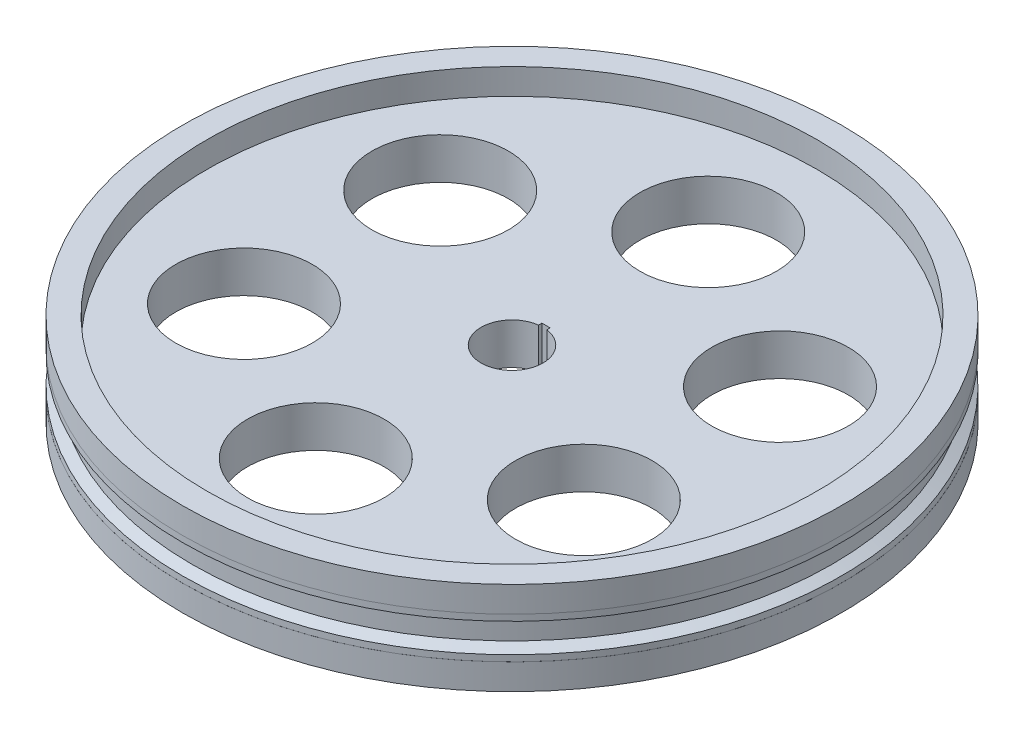
ISO-10303-21;
HEADER;
FILE_DESCRIPTION(('STEP AP214'),'2;1');
FILE_NAME('part.step','',(''),(''),'','','');
FILE_SCHEMA(('AUTOMOTIVE_DESIGN { 1 0 10303 214 1 1 1 1 }'));
ENDSEC;
DATA;
#1=APPLICATION_CONTEXT('core data for automotive mechanical design processes');
#2=APPLICATION_PROTOCOL_DEFINITION('international standard','automotive_design',2000,#1);
#3=PRODUCT_CONTEXT('',#1,'mechanical');
#4=PRODUCT('Part','Part','',(#3));
#5=PRODUCT_RELATED_PRODUCT_CATEGORY('part','',(#4));
#6=PRODUCT_DEFINITION_FORMATION('','',#4);
#7=PRODUCT_DEFINITION_CONTEXT('part definition',#1,'design');
#8=PRODUCT_DEFINITION('design','',#6,#7);
#9=PRODUCT_DEFINITION_SHAPE('','',#8);
#10=(LENGTH_UNIT() NAMED_UNIT(*) SI_UNIT(.MILLI.,.METRE.));
#11=(NAMED_UNIT(*) PLANE_ANGLE_UNIT() SI_UNIT($,.RADIAN.));
#12=(NAMED_UNIT(*) SI_UNIT($,.STERADIAN.) SOLID_ANGLE_UNIT());
#13=UNCERTAINTY_MEASURE_WITH_UNIT(LENGTH_MEASURE(1.E-05),#10,'distance_accuracy_value','');
#14=(GEOMETRIC_REPRESENTATION_CONTEXT(3) GLOBAL_UNCERTAINTY_ASSIGNED_CONTEXT((#13)) GLOBAL_UNIT_ASSIGNED_CONTEXT((#10,
#11,#12)) REPRESENTATION_CONTEXT('',''));
#15=CARTESIAN_POINT('',(0.,0.,0.));
#16=DIRECTION('',(0.,0.,1.));
#17=DIRECTION('',(1.,0.,0.));
#18=AXIS2_PLACEMENT_3D('',#15,#16,#17);
#19=CARTESIAN_POINT('',(0.,-10.,0.));
#20=DIRECTION('',(0.,1.,0.));
#21=DIRECTION('',(0.,0.,1.));
#22=AXIS2_PLACEMENT_3D('',#19,#20,#21);
#23=PLANE('',#22);
#24=CARTESIAN_POINT('',(-82.3240268063419,-10.,-47.5297990374131));
#25=DIRECTION('',(0.,1.,0.));
#26=DIRECTION('',(0.,0.,1.));
#27=AXIS2_PLACEMENT_3D('',#24,#25,#26);
#28=CIRCLE('',#27,33.0759403003965);
#29=CARTESIAN_POINT('',(-82.3240268063419,-10.,-14.4538587370166));
#30=VERTEX_POINT('',#29);
#31=EDGE_CURVE('E252',#30,#30,#28,.T.);
#32=ORIENTED_EDGE('',*,*,#31,.T.);
#33=EDGE_LOOP('',(#32));
#34=FACE_BOUND('',#33,.T.);
#35=CARTESIAN_POINT('',(-82.3240268063378,-10.,47.5297990374201));
#36=DIRECTION('',(0.,1.,0.));
#37=DIRECTION('',(0.,0.,1.));
#38=AXIS2_PLACEMENT_3D('',#35,#36,#37);
#39=CIRCLE('',#38,33.0759403004001);
#40=CARTESIAN_POINT('',(-82.3240268063378,-10.,80.6057393378202));
#41=VERTEX_POINT('',#40);
#42=EDGE_CURVE('E256',#41,#41,#39,.T.);
#43=ORIENTED_EDGE('',*,*,#42,.T.);
#44=EDGE_LOOP('',(#43));
#45=FACE_BOUND('',#44,.T.);
#46=CARTESIAN_POINT('',(8.07034449540853E-12,-10.,95.0595980748332));
#47=DIRECTION('',(0.,1.,0.));
#48=DIRECTION('',(0.,0.,1.));
#49=AXIS2_PLACEMENT_3D('',#46,#47,#48);
#50=CIRCLE('',#49,33.0759403004008);
#51=CARTESIAN_POINT('',(8.07034449540853E-12,-10.,128.135538375234));
#52=VERTEX_POINT('',#51);
#53=EDGE_CURVE('E262',#52,#52,#50,.T.);
#54=ORIENTED_EDGE('',*,*,#53,.T.);
#55=EDGE_LOOP('',(#54));
#56=FACE_BOUND('',#55,.T.);
#57=CARTESIAN_POINT('',(82.3240268063499,-10.,47.5297990374131));
#58=DIRECTION('',(0.,1.,0.));
#59=DIRECTION('',(0.,0.,1.));
#60=AXIS2_PLACEMENT_3D('',#57,#58,#59);
#61=CIRCLE('',#60,33.0759403003976);
#62=CARTESIAN_POINT('',(82.3240268063499,-10.,80.6057393378107));
#63=VERTEX_POINT('',#62);
#64=EDGE_CURVE('E268',#63,#63,#61,.T.);
#65=ORIENTED_EDGE('',*,*,#64,.T.);
#66=EDGE_LOOP('',(#65));
#67=FACE_BOUND('',#66,.T.);
#68=CARTESIAN_POINT('',(82.3240268063459,-10.,-47.5297990374201));
#69=DIRECTION('',(0.,1.,0.));
#70=DIRECTION('',(0.,0.,1.));
#71=AXIS2_PLACEMENT_3D('',#68,#69,#70);
#72=CIRCLE('',#71,33.0759403003936);
#73=CARTESIAN_POINT('',(82.3240268063459,-10.,-14.4538587370266));
#74=VERTEX_POINT('',#73);
#75=EDGE_CURVE('E274',#74,#74,#72,.T.);
#76=ORIENTED_EDGE('',*,*,#75,.T.);
#77=EDGE_LOOP('',(#76));
#78=FACE_BOUND('',#77,.T.);
#79=CARTESIAN_POINT('',(0.,-10.,-95.0595980748332));
#80=DIRECTION('',(0.,1.,0.));
#81=DIRECTION('',(0.,0.,1.));
#82=AXIS2_PLACEMENT_3D('',#79,#80,#81);
#83=CIRCLE('',#82,33.0759403003924);
#84=CARTESIAN_POINT('',(0.,-10.,-61.9836577744408));
#85=VERTEX_POINT('',#84);
#86=EDGE_CURVE('E280',#85,#85,#83,.T.);
#87=ORIENTED_EDGE('',*,*,#86,.T.);
#88=EDGE_LOOP('',(#87));
#89=FACE_BOUND('',#88,.T.);
#90=CARTESIAN_POINT('',(0.,-10.,0.));
#91=DIRECTION('',(0.,1.,0.));
#92=DIRECTION('',(0.,0.,1.));
#93=AXIS2_PLACEMENT_3D('',#90,#91,#92);
#94=CIRCLE('',#93,15.);
#95=CARTESIAN_POINT('',(-2.,-10.,-14.8660687473185));
#96=VERTEX_POINT('',#95);
#97=CARTESIAN_POINT('',(2.,-10.,-14.8660687473185));
#98=VERTEX_POINT('',#97);
#99=EDGE_CURVE('E55',#96,#98,#94,.T.);
#100=ORIENTED_EDGE('',*,*,#99,.T.);
#101=DIRECTION('',(0.,0.,-1.));
#102=VECTOR('',#101,1.);
#103=CARTESIAN_POINT('',(2.,-10.,-16.5));
#104=LINE('',#103,#102);
#105=CARTESIAN_POINT('',(2.,-10.,-16.5));
#106=VERTEX_POINT('',#105);
#107=EDGE_CURVE('E88',#98,#106,#104,.T.);
#108=ORIENTED_EDGE('',*,*,#107,.T.);
#109=DIRECTION('',(-1.,0.,0.));
#110=VECTOR('',#109,1.);
#111=CARTESIAN_POINT('',(-2.,-10.,-16.5));
#112=LINE('',#111,#110);
#113=CARTESIAN_POINT('',(-2.,-10.,-16.5));
#114=VERTEX_POINT('',#113);
#115=EDGE_CURVE('E105',#106,#114,#112,.T.);
#116=ORIENTED_EDGE('',*,*,#115,.T.);
#117=DIRECTION('',(0.,0.,1.));
#118=VECTOR('',#117,1.);
#119=CARTESIAN_POINT('',(-2.,-10.,-16.5));
#120=LINE('',#119,#118);
#121=EDGE_CURVE('E82',#114,#96,#120,.T.);
#122=ORIENTED_EDGE('',*,*,#121,.T.);
#123=EDGE_LOOP('',(#100,#108,#116,#122));
#124=FACE_BOUND('',#123,.T.);
#125=CARTESIAN_POINT('',(0.,-10.,0.));
#126=DIRECTION('',(0.,1.,0.));
#127=DIRECTION('',(0.,0.,1.));
#128=AXIS2_PLACEMENT_3D('',#125,#126,#127);
#129=CIRCLE('',#128,147.665159843308);
#130=CARTESIAN_POINT('',(0.,-10.,147.665159843308));
#131=VERTEX_POINT('',#130);
#132=EDGE_CURVE('E11',#131,#131,#129,.T.);
#133=ORIENTED_EDGE('',*,*,#132,.F.);
#134=EDGE_LOOP('',(#133));
#135=FACE_BOUND('',#134,.T.);
#136=ADVANCED_FACE('F32',(#34,#45,#56,#67,#78,#89,#124,#135),#23,.F.);
#137=CARTESIAN_POINT('',(0.,10.,0.));
#138=DIRECTION('',(0.,1.,0.));
#139=DIRECTION('',(0.,0.,1.));
#140=AXIS2_PLACEMENT_3D('',#137,#138,#139);
#141=PLANE('',#140);
#142=CARTESIAN_POINT('',(-82.3240268063419,10.,-47.5297990374131));
#143=DIRECTION('',(0.,1.,0.));
#144=DIRECTION('',(0.,0.,1.));
#145=AXIS2_PLACEMENT_3D('',#142,#143,#144);
#146=CIRCLE('',#145,33.0759403003965);
#147=CARTESIAN_POINT('',(-82.3240268063419,10.,-14.4538587370166));
#148=VERTEX_POINT('',#147);
#149=EDGE_CURVE('E253',#148,#148,#146,.T.);
#150=ORIENTED_EDGE('',*,*,#149,.F.);
#151=EDGE_LOOP('',(#150));
#152=FACE_BOUND('',#151,.T.);
#153=CARTESIAN_POINT('',(8.07034449540853E-12,10.,95.0595980748332));
#154=DIRECTION('',(0.,1.,0.));
#155=DIRECTION('',(0.,0.,1.));
#156=AXIS2_PLACEMENT_3D('',#153,#154,#155);
#157=CIRCLE('',#156,33.0759403004008);
#158=CARTESIAN_POINT('',(8.07034449540853E-12,10.,128.135538375234));
#159=VERTEX_POINT('',#158);
#160=EDGE_CURVE('E265',#159,#159,#157,.T.);
#161=ORIENTED_EDGE('',*,*,#160,.F.);
#162=EDGE_LOOP('',(#161));
#163=FACE_BOUND('',#162,.T.);
#164=CARTESIAN_POINT('',(82.3240268063459,10.,-47.5297990374201));
#165=DIRECTION('',(0.,1.,0.));
#166=DIRECTION('',(0.,0.,1.));
#167=AXIS2_PLACEMENT_3D('',#164,#165,#166);
#168=CIRCLE('',#167,33.0759403003936);
#169=CARTESIAN_POINT('',(82.3240268063459,10.,-14.4538587370266));
#170=VERTEX_POINT('',#169);
#171=EDGE_CURVE('E277',#170,#170,#168,.T.);
#172=ORIENTED_EDGE('',*,*,#171,.F.);
#173=EDGE_LOOP('',(#172));
#174=FACE_BOUND('',#173,.T.);
#175=DIRECTION('',(0.,0.,-1.));
#176=VECTOR('',#175,1.);
#177=CARTESIAN_POINT('',(2.,10.,-16.5));
#178=LINE('',#177,#176);
#179=CARTESIAN_POINT('',(2.,10.,-14.8660687473185));
#180=VERTEX_POINT('',#179);
#181=CARTESIAN_POINT('',(2.,10.,-16.5));
#182=VERTEX_POINT('',#181);
#183=EDGE_CURVE('E81',#180,#182,#178,.T.);
#184=ORIENTED_EDGE('',*,*,#183,.F.);
#185=CARTESIAN_POINT('',(0.,10.,0.));
#186=DIRECTION('',(0.,1.,0.));
#187=DIRECTION('',(0.,0.,1.));
#188=AXIS2_PLACEMENT_3D('',#185,#186,#187);
#189=CIRCLE('',#188,15.);
#190=CARTESIAN_POINT('',(-2.,10.,-14.8660687473185));
#191=VERTEX_POINT('',#190);
#192=EDGE_CURVE('E73',#191,#180,#189,.T.);
#193=ORIENTED_EDGE('',*,*,#192,.F.);
#194=DIRECTION('',(0.,0.,1.));
#195=VECTOR('',#194,1.);
#196=CARTESIAN_POINT('',(-2.,10.,-16.5));
#197=LINE('',#196,#195);
#198=CARTESIAN_POINT('',(-2.,10.,-16.5));
#199=VERTEX_POINT('',#198);
#200=EDGE_CURVE('E97',#199,#191,#197,.T.);
#201=ORIENTED_EDGE('',*,*,#200,.F.);
#202=DIRECTION('',(-1.,0.,0.));
#203=VECTOR('',#202,1.);
#204=CARTESIAN_POINT('',(-2.,10.,-16.5));
#205=LINE('',#204,#203);
#206=EDGE_CURVE('E95',#182,#199,#205,.T.);
#207=ORIENTED_EDGE('',*,*,#206,.F.);
#208=EDGE_LOOP('',(#184,#193,#201,#207));
#209=FACE_BOUND('',#208,.T.);
#210=CARTESIAN_POINT('',(0.,10.,-95.0595980748332));
#211=DIRECTION('',(0.,1.,0.));
#212=DIRECTION('',(0.,0.,1.));
#213=AXIS2_PLACEMENT_3D('',#210,#211,#212);
#214=CIRCLE('',#213,33.0759403003924);
#215=CARTESIAN_POINT('',(0.,10.,-61.9836577744408));
#216=VERTEX_POINT('',#215);
#217=EDGE_CURVE('E103',#216,#216,#214,.T.);
#218=ORIENTED_EDGE('',*,*,#217,.F.);
#219=EDGE_LOOP('',(#218));
#220=FACE_BOUND('',#219,.T.);
#221=CARTESIAN_POINT('',(82.3240268063499,10.,47.5297990374131));
#222=DIRECTION('',(0.,1.,0.));
#223=DIRECTION('',(0.,0.,1.));
#224=AXIS2_PLACEMENT_3D('',#221,#222,#223);
#225=CIRCLE('',#224,33.0759403003976);
#226=CARTESIAN_POINT('',(82.3240268063499,10.,80.6057393378107));
#227=VERTEX_POINT('',#226);
#228=EDGE_CURVE('E271',#227,#227,#225,.T.);
#229=ORIENTED_EDGE('',*,*,#228,.F.);
#230=EDGE_LOOP('',(#229));
#231=FACE_BOUND('',#230,.T.);
#232=CARTESIAN_POINT('',(-82.3240268063378,10.,47.5297990374201));
#233=DIRECTION('',(0.,1.,0.));
#234=DIRECTION('',(0.,0.,1.));
#235=AXIS2_PLACEMENT_3D('',#232,#233,#234);
#236=CIRCLE('',#235,33.0759403004001);
#237=CARTESIAN_POINT('',(-82.3240268063378,10.,80.6057393378202));
#238=VERTEX_POINT('',#237);
#239=EDGE_CURVE('E259',#238,#238,#236,.T.);
#240=ORIENTED_EDGE('',*,*,#239,.F.);
#241=EDGE_LOOP('',(#240));
#242=FACE_BOUND('',#241,.T.);
#243=CARTESIAN_POINT('',(0.,10.,0.));
#244=DIRECTION('',(0.,1.,0.));
#245=DIRECTION('',(0.,0.,1.));
#246=AXIS2_PLACEMENT_3D('',#243,#244,#245);
#247=CIRCLE('',#246,147.665159843308);
#248=CARTESIAN_POINT('',(0.,10.,147.665159843308));
#249=VERTEX_POINT('',#248);
#250=EDGE_CURVE('E40',#249,#249,#247,.F.);
#251=ORIENTED_EDGE('',*,*,#250,.F.);
#252=EDGE_LOOP('',(#251));
#253=FACE_BOUND('',#252,.T.);
#254=ADVANCED_FACE('F93',(#152,#163,#174,#209,#220,#231,#242,#253),#141,.T.);
#255=CARTESIAN_POINT('',(0.,10.,0.));
#256=DIRECTION('',(0.,-1.,0.));
#257=DIRECTION('',(0.,0.,-1.));
#258=AXIS2_PLACEMENT_3D('',#255,#256,#257);
#259=CYLINDRICAL_SURFACE('',#258,155.);
#260=CARTESIAN_POINT('',(0.,-4.5,0.));
#261=DIRECTION('',(0.,-1.,0.));
#262=DIRECTION('',(0.,0.,-1.));
#263=AXIS2_PLACEMENT_3D('',#260,#261,#262);
#264=CIRCLE('',#263,155.);
#265=CARTESIAN_POINT('',(0.,-4.5,-155.));
#266=VERTEX_POINT('',#265);
#267=EDGE_CURVE('E89',#266,#266,#264,.T.);
#268=ORIENTED_EDGE('',*,*,#267,.F.);
#269=EDGE_LOOP('',(#268));
#270=FACE_BOUND('',#269,.T.);
#271=CARTESIAN_POINT('',(0.,4.5,0.));
#272=DIRECTION('',(0.,1.,0.));
#273=DIRECTION('',(0.,0.,1.));
#274=AXIS2_PLACEMENT_3D('',#271,#272,#273);
#275=CIRCLE('',#274,155.);
#276=CARTESIAN_POINT('',(0.,4.5,155.));
#277=VERTEX_POINT('',#276);
#278=EDGE_CURVE('E115',#277,#277,#275,.T.);
#279=ORIENTED_EDGE('',*,*,#278,.F.);
#280=EDGE_LOOP('',(#279));
#281=FACE_BOUND('',#280,.T.);
#282=ADVANCED_FACE('F34',(#270,#281),#259,.T.);
#283=CARTESIAN_POINT('',(0.,10.,0.));
#284=DIRECTION('',(0.,-1.,0.));
#285=DIRECTION('',(0.,0.,-1.));
#286=AXIS2_PLACEMENT_3D('',#283,#284,#285);
#287=CYLINDRICAL_SURFACE('',#286,15.);
#288=ORIENTED_EDGE('',*,*,#99,.F.);
#289=DIRECTION('',(0.,-1.,0.));
#290=VECTOR('',#289,1.);
#291=CARTESIAN_POINT('',(-2.,10.,-14.8660687473185));
#292=LINE('',#291,#290);
#293=EDGE_CURVE('E77',#191,#96,#292,.T.);
#294=ORIENTED_EDGE('',*,*,#293,.F.);
#295=ORIENTED_EDGE('',*,*,#192,.T.);
#296=DIRECTION('',(0.,-1.,0.));
#297=VECTOR('',#296,1.);
#298=CARTESIAN_POINT('',(2.,10.,-14.8660687473185));
#299=LINE('',#298,#297);
#300=EDGE_CURVE('E76',#180,#98,#299,.T.);
#301=ORIENTED_EDGE('',*,*,#300,.T.);
#302=EDGE_LOOP('',(#288,#294,#295,#301));
#303=FACE_BOUND('',#302,.T.);
#304=ADVANCED_FACE('F75',(#303),#287,.F.);
#305=CARTESIAN_POINT('',(2.,10.,-16.5));
#306=DIRECTION('',(-1.,0.,0.));
#307=DIRECTION('',(0.,0.,1.));
#308=AXIS2_PLACEMENT_3D('',#305,#306,#307);
#309=PLANE('',#308);
#310=ORIENTED_EDGE('',*,*,#107,.F.);
#311=ORIENTED_EDGE('',*,*,#300,.F.);
#312=ORIENTED_EDGE('',*,*,#183,.T.);
#313=DIRECTION('',(0.,-1.,0.));
#314=VECTOR('',#313,1.);
#315=CARTESIAN_POINT('',(2.,10.,-16.5));
#316=LINE('',#315,#314);
#317=EDGE_CURVE('E90',#182,#106,#316,.T.);
#318=ORIENTED_EDGE('',*,*,#317,.T.);
#319=EDGE_LOOP('',(#310,#311,#312,#318));
#320=FACE_BOUND('',#319,.T.);
#321=ADVANCED_FACE('F85',(#320),#309,.T.);
#322=CARTESIAN_POINT('',(-2.,10.,-16.5));
#323=DIRECTION('',(0.,0.,1.));
#324=DIRECTION('',(1.,0.,0.));
#325=AXIS2_PLACEMENT_3D('',#322,#323,#324);
#326=PLANE('',#325);
#327=ORIENTED_EDGE('',*,*,#115,.F.);
#328=ORIENTED_EDGE('',*,*,#317,.F.);
#329=ORIENTED_EDGE('',*,*,#206,.T.);
#330=DIRECTION('',(0.,-1.,0.));
#331=VECTOR('',#330,1.);
#332=CARTESIAN_POINT('',(-2.,10.,-16.5));
#333=LINE('',#332,#331);
#334=EDGE_CURVE('E47',#199,#114,#333,.T.);
#335=ORIENTED_EDGE('',*,*,#334,.T.);
#336=EDGE_LOOP('',(#327,#328,#329,#335));
#337=FACE_BOUND('',#336,.T.);
#338=ADVANCED_FACE('F138',(#337),#326,.T.);
#339=CARTESIAN_POINT('',(-2.,10.,-16.5));
#340=DIRECTION('',(1.,0.,0.));
#341=DIRECTION('',(0.,0.,-1.));
#342=AXIS2_PLACEMENT_3D('',#339,#340,#341);
#343=PLANE('',#342);
#344=ORIENTED_EDGE('',*,*,#121,.F.);
#345=ORIENTED_EDGE('',*,*,#334,.F.);
#346=ORIENTED_EDGE('',*,*,#200,.T.);
#347=ORIENTED_EDGE('',*,*,#293,.T.);
#348=EDGE_LOOP('',(#344,#345,#346,#347));
#349=FACE_BOUND('',#348,.T.);
#350=ADVANCED_FACE('F141',(#349),#343,.T.);
#351=CARTESIAN_POINT('',(0.,10.,-95.0595980748332));
#352=DIRECTION('',(0.,-1.,0.));
#353=DIRECTION('',(0.,0.,-1.));
#354=AXIS2_PLACEMENT_3D('',#351,#352,#353);
#355=CYLINDRICAL_SURFACE('',#354,33.0759403003924);
#356=ORIENTED_EDGE('',*,*,#217,.T.);
#357=EDGE_LOOP('',(#356));
#358=FACE_BOUND('',#357,.T.);
#359=ORIENTED_EDGE('',*,*,#86,.F.);
#360=EDGE_LOOP('',(#359));
#361=FACE_BOUND('',#360,.T.);
#362=ADVANCED_FACE('F145',(#358,#361),#355,.F.);
#363=CARTESIAN_POINT('',(82.3240268063459,10.,-47.5297990374201));
#364=DIRECTION('',(0.,-1.,0.));
#365=DIRECTION('',(0.,0.,-1.));
#366=AXIS2_PLACEMENT_3D('',#363,#364,#365);
#367=CYLINDRICAL_SURFACE('',#366,33.0759403003936);
#368=ORIENTED_EDGE('',*,*,#171,.T.);
#369=EDGE_LOOP('',(#368));
#370=FACE_BOUND('',#369,.T.);
#371=ORIENTED_EDGE('',*,*,#75,.F.);
#372=EDGE_LOOP('',(#371));
#373=FACE_BOUND('',#372,.T.);
#374=ADVANCED_FACE('F148',(#370,#373),#367,.F.);
#375=CARTESIAN_POINT('',(82.3240268063499,10.,47.5297990374131));
#376=DIRECTION('',(0.,-1.,0.));
#377=DIRECTION('',(0.,0.,-1.));
#378=AXIS2_PLACEMENT_3D('',#375,#376,#377);
#379=CYLINDRICAL_SURFACE('',#378,33.0759403003976);
#380=ORIENTED_EDGE('',*,*,#228,.T.);
#381=EDGE_LOOP('',(#380));
#382=FACE_BOUND('',#381,.T.);
#383=ORIENTED_EDGE('',*,*,#64,.F.);
#384=EDGE_LOOP('',(#383));
#385=FACE_BOUND('',#384,.T.);
#386=ADVANCED_FACE('F152',(#382,#385),#379,.F.);
#387=CARTESIAN_POINT('',(8.07034449540853E-12,10.,95.0595980748332));
#388=DIRECTION('',(0.,-1.,0.));
#389=DIRECTION('',(0.,0.,-1.));
#390=AXIS2_PLACEMENT_3D('',#387,#388,#389);
#391=CYLINDRICAL_SURFACE('',#390,33.0759403004008);
#392=ORIENTED_EDGE('',*,*,#160,.T.);
#393=EDGE_LOOP('',(#392));
#394=FACE_BOUND('',#393,.T.);
#395=ORIENTED_EDGE('',*,*,#53,.F.);
#396=EDGE_LOOP('',(#395));
#397=FACE_BOUND('',#396,.T.);
#398=ADVANCED_FACE('F156',(#394,#397),#391,.F.);
#399=CARTESIAN_POINT('',(-82.3240268063378,10.,47.5297990374201));
#400=DIRECTION('',(0.,-1.,0.));
#401=DIRECTION('',(0.,0.,-1.));
#402=AXIS2_PLACEMENT_3D('',#399,#400,#401);
#403=CYLINDRICAL_SURFACE('',#402,33.0759403004001);
#404=ORIENTED_EDGE('',*,*,#239,.T.);
#405=EDGE_LOOP('',(#404));
#406=FACE_BOUND('',#405,.T.);
#407=ORIENTED_EDGE('',*,*,#42,.F.);
#408=EDGE_LOOP('',(#407));
#409=FACE_BOUND('',#408,.T.);
#410=ADVANCED_FACE('F160',(#406,#409),#403,.F.);
#411=CARTESIAN_POINT('',(-82.3240268063419,10.,-47.5297990374131));
#412=DIRECTION('',(0.,-1.,0.));
#413=DIRECTION('',(0.,0.,-1.));
#414=AXIS2_PLACEMENT_3D('',#411,#412,#413);
#415=CYLINDRICAL_SURFACE('',#414,33.0759403003965);
#416=ORIENTED_EDGE('',*,*,#149,.T.);
#417=EDGE_LOOP('',(#416));
#418=FACE_BOUND('',#417,.T.);
#419=ORIENTED_EDGE('',*,*,#31,.F.);
#420=EDGE_LOOP('',(#419));
#421=FACE_BOUND('',#420,.T.);
#422=ADVANCED_FACE('F164',(#418,#421),#415,.F.);
#423=CARTESIAN_POINT('',(0.,-7.,0.));
#424=DIRECTION('',(0.,-1.,0.));
#425=DIRECTION('',(0.,0.,-1.));
#426=AXIS2_PLACEMENT_3D('',#423,#424,#425);
#427=CONICAL_SURFACE('',#426,159.641767411275,1.07675696417816);
#428=ORIENTED_EDGE('',*,*,#267,.T.);
#429=EDGE_LOOP('',(#428));
#430=FACE_BOUND('',#429,.T.);
#431=CARTESIAN_POINT('',(0.,-7.,0.));
#432=DIRECTION('',(0.,1.,0.));
#433=DIRECTION('',(0.,0.,1.));
#434=AXIS2_PLACEMENT_3D('',#431,#432,#433);
#435=CIRCLE('',#434,159.641767411275);
#436=CARTESIAN_POINT('',(0.,-7.,159.641767411275));
#437=VERTEX_POINT('',#436);
#438=EDGE_CURVE('E249',#437,#437,#435,.T.);
#439=ORIENTED_EDGE('',*,*,#438,.T.);
#440=EDGE_LOOP('',(#439));
#441=FACE_BOUND('',#440,.T.);
#442=ADVANCED_FACE('F168',(#430,#441),#427,.T.);
#443=CARTESIAN_POINT('',(0.,10.,0.));
#444=DIRECTION('',(0.,1.,0.));
#445=DIRECTION('',(0.,0.,1.));
#446=AXIS2_PLACEMENT_3D('',#443,#444,#445);
#447=CYLINDRICAL_SURFACE('',#446,159.641767411275);
#448=ORIENTED_EDGE('',*,*,#438,.F.);
#449=EDGE_LOOP('',(#448));
#450=FACE_BOUND('',#449,.T.);
#451=CARTESIAN_POINT('',(0.,-10.,0.));
#452=DIRECTION('',(0.,-1.,0.));
#453=DIRECTION('',(0.,0.,-1.));
#454=AXIS2_PLACEMENT_3D('',#451,#452,#453);
#455=CIRCLE('',#454,159.641767411275);
#456=CARTESIAN_POINT('',(0.,-10.,-159.641767411275));
#457=VERTEX_POINT('',#456);
#458=EDGE_CURVE('E230',#457,#457,#455,.T.);
#459=ORIENTED_EDGE('',*,*,#458,.F.);
#460=EDGE_LOOP('',(#459));
#461=FACE_BOUND('',#460,.T.);
#462=ADVANCED_FACE('F172',(#450,#461),#447,.T.);
#463=CARTESIAN_POINT('',(0.,4.5,0.));
#464=DIRECTION('',(0.,1.,0.));
#465=DIRECTION('',(0.,0.,1.));
#466=AXIS2_PLACEMENT_3D('',#463,#464,#465);
#467=CONICAL_SURFACE('',#466,155.,1.07675696417816);
#468=CARTESIAN_POINT('',(0.,7.,0.));
#469=DIRECTION('',(0.,1.,0.));
#470=DIRECTION('',(0.,0.,1.));
#471=AXIS2_PLACEMENT_3D('',#468,#469,#470);
#472=CIRCLE('',#471,159.641767411275);
#473=CARTESIAN_POINT('',(0.,7.,159.641767411275));
#474=VERTEX_POINT('',#473);
#475=EDGE_CURVE('E246',#474,#474,#472,.T.);
#476=ORIENTED_EDGE('',*,*,#475,.F.);
#477=EDGE_LOOP('',(#476));
#478=FACE_BOUND('',#477,.T.);
#479=ORIENTED_EDGE('',*,*,#278,.T.);
#480=EDGE_LOOP('',(#479));
#481=FACE_BOUND('',#480,.T.);
#482=ADVANCED_FACE('F176',(#478,#481),#467,.T.);
#483=CARTESIAN_POINT('',(0.,10.,0.));
#484=DIRECTION('',(0.,1.,0.));
#485=DIRECTION('',(0.,0.,1.));
#486=AXIS2_PLACEMENT_3D('',#483,#484,#485);
#487=CYLINDRICAL_SURFACE('',#486,159.641767411275);
#488=CARTESIAN_POINT('',(0.,10.,0.));
#489=DIRECTION('',(0.,1.,0.));
#490=DIRECTION('',(0.,0.,1.));
#491=AXIS2_PLACEMENT_3D('',#488,#489,#490);
#492=CIRCLE('',#491,159.641767411275);
#493=CARTESIAN_POINT('',(0.,10.,159.641767411275));
#494=VERTEX_POINT('',#493);
#495=EDGE_CURVE('E241',#494,#494,#492,.T.);
#496=ORIENTED_EDGE('',*,*,#495,.F.);
#497=EDGE_LOOP('',(#496));
#498=FACE_BOUND('',#497,.T.);
#499=ORIENTED_EDGE('',*,*,#475,.T.);
#500=EDGE_LOOP('',(#499));
#501=FACE_BOUND('',#500,.T.);
#502=ADVANCED_FACE('F180',(#498,#501),#487,.T.);
#503=CARTESIAN_POINT('',(0.,22.5,0.));
#504=DIRECTION('',(0.,1.,0.));
#505=DIRECTION('',(0.,0.,1.));
#506=AXIS2_PLACEMENT_3D('',#503,#504,#505);
#507=PLANE('',#506);
#508=CARTESIAN_POINT('',(0.,22.5,0.));
#509=DIRECTION('',(0.,1.,0.));
#510=DIRECTION('',(0.,0.,1.));
#511=AXIS2_PLACEMENT_3D('',#508,#509,#510);
#512=CIRCLE('',#511,159.665159843308);
#513=CARTESIAN_POINT('',(0.,22.5,159.665159843308));
#514=VERTEX_POINT('',#513);
#515=EDGE_CURVE('E238',#514,#514,#512,.T.);
#516=ORIENTED_EDGE('',*,*,#515,.T.);
#517=EDGE_LOOP('',(#516));
#518=FACE_BOUND('',#517,.T.);
#519=CARTESIAN_POINT('',(0.,22.5,0.));
#520=DIRECTION('',(0.,1.,0.));
#521=DIRECTION('',(0.,0.,1.));
#522=AXIS2_PLACEMENT_3D('',#519,#520,#521);
#523=CIRCLE('',#522,147.665159843308);
#524=CARTESIAN_POINT('',(0.,22.5,147.665159843308));
#525=VERTEX_POINT('',#524);
#526=EDGE_CURVE('E234',#525,#525,#523,.T.);
#527=ORIENTED_EDGE('',*,*,#526,.F.);
#528=EDGE_LOOP('',(#527));
#529=FACE_BOUND('',#528,.T.);
#530=ADVANCED_FACE('F184',(#518,#529),#507,.T.);
#531=CARTESIAN_POINT('',(0.,10.,0.));
#532=DIRECTION('',(0.,1.,0.));
#533=DIRECTION('',(0.,0.,1.));
#534=AXIS2_PLACEMENT_3D('',#531,#532,#533);
#535=PLANE('',#534);
#536=ORIENTED_EDGE('',*,*,#495,.T.);
#537=EDGE_LOOP('',(#536));
#538=FACE_BOUND('',#537,.T.);
#539=CARTESIAN_POINT('',(0.,10.,0.));
#540=DIRECTION('',(0.,1.,0.));
#541=DIRECTION('',(0.,0.,1.));
#542=AXIS2_PLACEMENT_3D('',#539,#540,#541);
#543=CIRCLE('',#542,159.665159843308);
#544=CARTESIAN_POINT('',(0.,10.,159.665159843308));
#545=VERTEX_POINT('',#544);
#546=EDGE_CURVE('E237',#545,#545,#543,.T.);
#547=ORIENTED_EDGE('',*,*,#546,.F.);
#548=EDGE_LOOP('',(#547));
#549=FACE_BOUND('',#548,.T.);
#550=ADVANCED_FACE('F189',(#538,#549),#535,.F.);
#551=CARTESIAN_POINT('',(0.,22.5,0.));
#552=DIRECTION('',(0.,-1.,0.));
#553=DIRECTION('',(0.,0.,-1.));
#554=AXIS2_PLACEMENT_3D('',#551,#552,#553);
#555=CYLINDRICAL_SURFACE('',#554,159.665159843308);
#556=ORIENTED_EDGE('',*,*,#515,.F.);
#557=EDGE_LOOP('',(#556));
#558=FACE_BOUND('',#557,.T.);
#559=ORIENTED_EDGE('',*,*,#546,.T.);
#560=EDGE_LOOP('',(#559));
#561=FACE_BOUND('',#560,.T.);
#562=ADVANCED_FACE('F186',(#558,#561),#555,.T.);
#563=CARTESIAN_POINT('',(0.,22.5,0.));
#564=DIRECTION('',(0.,-1.,0.));
#565=DIRECTION('',(0.,0.,-1.));
#566=AXIS2_PLACEMENT_3D('',#563,#564,#565);
#567=CYLINDRICAL_SURFACE('',#566,147.665159843308);
#568=ORIENTED_EDGE('',*,*,#526,.T.);
#569=EDGE_LOOP('',(#568));
#570=FACE_BOUND('',#569,.T.);
#571=ORIENTED_EDGE('',*,*,#250,.T.);
#572=EDGE_LOOP('',(#571));
#573=FACE_BOUND('',#572,.T.);
#574=ADVANCED_FACE('F120',(#570,#573),#567,.F.);
#575=CARTESIAN_POINT('',(0.,-22.5,0.));
#576=DIRECTION('',(0.,1.,0.));
#577=DIRECTION('',(0.,0.,1.));
#578=AXIS2_PLACEMENT_3D('',#575,#576,#577);
#579=CYLINDRICAL_SURFACE('',#578,159.665159843308);
#580=CARTESIAN_POINT('',(0.,-22.5,0.));
#581=DIRECTION('',(0.,1.,0.));
#582=DIRECTION('',(0.,0.,1.));
#583=AXIS2_PLACEMENT_3D('',#580,#581,#582);
#584=CIRCLE('',#583,159.665159843308);
#585=CARTESIAN_POINT('',(0.,-22.5,159.665159843308));
#586=VERTEX_POINT('',#585);
#587=EDGE_CURVE('E226',#586,#586,#584,.T.);
#588=ORIENTED_EDGE('',*,*,#587,.T.);
#589=EDGE_LOOP('',(#588));
#590=FACE_BOUND('',#589,.T.);
#591=CARTESIAN_POINT('',(0.,-10.,0.));
#592=DIRECTION('',(0.,1.,0.));
#593=DIRECTION('',(0.,0.,1.));
#594=AXIS2_PLACEMENT_3D('',#591,#592,#593);
#595=CIRCLE('',#594,159.665159843308);
#596=CARTESIAN_POINT('',(0.,-10.,159.665159843308));
#597=VERTEX_POINT('',#596);
#598=EDGE_CURVE('E223',#597,#597,#595,.T.);
#599=ORIENTED_EDGE('',*,*,#598,.F.);
#600=EDGE_LOOP('',(#599));
#601=FACE_BOUND('',#600,.T.);
#602=ADVANCED_FACE('F199',(#590,#601),#579,.T.);
#603=CARTESIAN_POINT('',(0.,-22.5,0.));
#604=DIRECTION('',(0.,-1.,0.));
#605=DIRECTION('',(0.,0.,1.));
#606=AXIS2_PLACEMENT_3D('',#603,#604,#605);
#607=PLANE('',#606);
#608=CARTESIAN_POINT('',(0.,-22.5,0.));
#609=DIRECTION('',(0.,1.,0.));
#610=DIRECTION('',(0.,0.,1.));
#611=AXIS2_PLACEMENT_3D('',#608,#609,#610);
#612=CIRCLE('',#611,147.665159843308);
#613=CARTESIAN_POINT('',(0.,-22.5,147.665159843308));
#614=VERTEX_POINT('',#613);
#615=EDGE_CURVE('E220',#614,#614,#612,.T.);
#616=ORIENTED_EDGE('',*,*,#615,.T.);
#617=EDGE_LOOP('',(#616));
#618=FACE_BOUND('',#617,.T.);
#619=ORIENTED_EDGE('',*,*,#587,.F.);
#620=EDGE_LOOP('',(#619));
#621=FACE_BOUND('',#620,.T.);
#622=ADVANCED_FACE('F203',(#618,#621),#607,.T.);
#623=CARTESIAN_POINT('',(0.,-10.,0.));
#624=DIRECTION('',(0.,-1.,0.));
#625=DIRECTION('',(0.,0.,1.));
#626=AXIS2_PLACEMENT_3D('',#623,#624,#625);
#627=PLANE('',#626);
#628=ORIENTED_EDGE('',*,*,#458,.T.);
#629=EDGE_LOOP('',(#628));
#630=FACE_BOUND('',#629,.T.);
#631=ORIENTED_EDGE('',*,*,#598,.T.);
#632=EDGE_LOOP('',(#631));
#633=FACE_BOUND('',#632,.T.);
#634=ADVANCED_FACE('F205',(#630,#633),#627,.F.);
#635=CARTESIAN_POINT('',(0.,-22.5,0.));
#636=DIRECTION('',(0.,1.,0.));
#637=DIRECTION('',(0.,0.,1.));
#638=AXIS2_PLACEMENT_3D('',#635,#636,#637);
#639=CYLINDRICAL_SURFACE('',#638,147.665159843308);
#640=ORIENTED_EDGE('',*,*,#615,.F.);
#641=EDGE_LOOP('',(#640));
#642=FACE_BOUND('',#641,.T.);
#643=ORIENTED_EDGE('',*,*,#132,.T.);
#644=EDGE_LOOP('',(#643));
#645=FACE_BOUND('',#644,.T.);
#646=ADVANCED_FACE('F208',(#642,#645),#639,.F.);
#647=CLOSED_SHELL('',(#136,#254,#282,#304,#321,#338,#350,#362,#374,#386,#398,#410,#422,#442,
#462,#482,#502,#530,#550,#562,#574,#602,#622,#634,#646));
#648=MANIFOLD_SOLID_BREP('B2',#647);
#649=ADVANCED_BREP_SHAPE_REPRESENTATION('',(#18,#648),#14);
#650=SHAPE_DEFINITION_REPRESENTATION(#9,#649);
ENDSEC;
END-ISO-10303-21;
